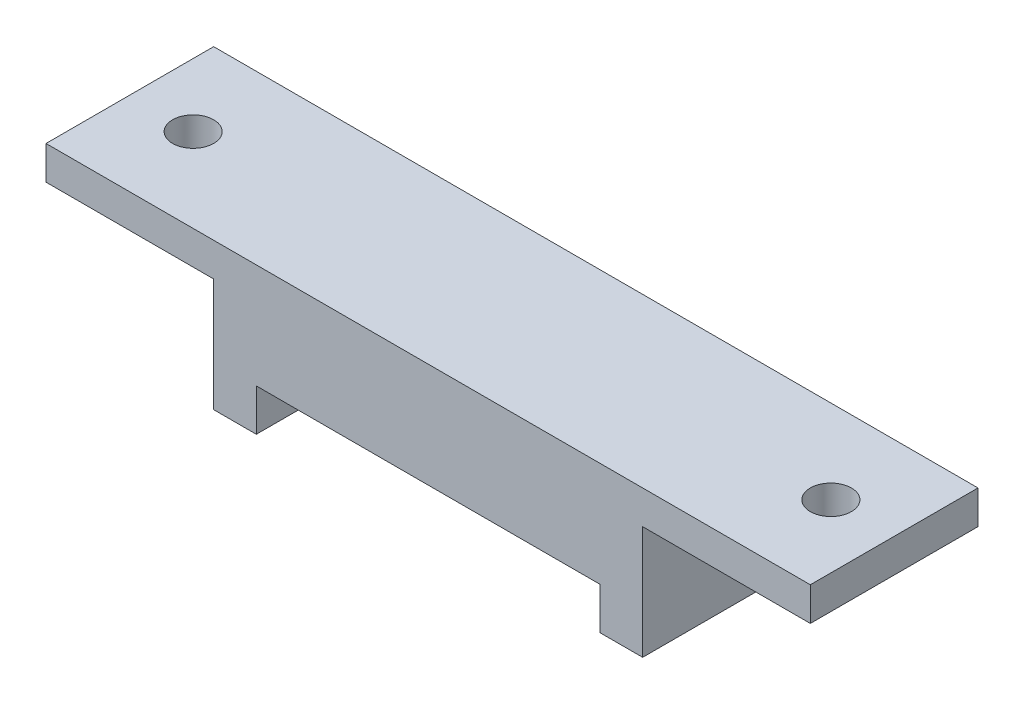
ISO-10303-21;
HEADER;
FILE_DESCRIPTION(('STEP AP214'),'2;1');
FILE_NAME('part.step','',(''),(''),'','','');
FILE_SCHEMA(('AUTOMOTIVE_DESIGN { 1 0 10303 214 1 1 1 1 }'));
ENDSEC;
DATA;
#1=APPLICATION_CONTEXT('core data for automotive mechanical design processes');
#2=APPLICATION_PROTOCOL_DEFINITION('international standard','automotive_design',2000,#1);
#3=PRODUCT_CONTEXT('',#1,'mechanical');
#4=PRODUCT('Part','Part','',(#3));
#5=PRODUCT_RELATED_PRODUCT_CATEGORY('part','',(#4));
#6=PRODUCT_DEFINITION_FORMATION('','',#4);
#7=PRODUCT_DEFINITION_CONTEXT('part definition',#1,'design');
#8=PRODUCT_DEFINITION('design','',#6,#7);
#9=PRODUCT_DEFINITION_SHAPE('','',#8);
#10=(LENGTH_UNIT() NAMED_UNIT(*) SI_UNIT(.MILLI.,.METRE.));
#11=(NAMED_UNIT(*) PLANE_ANGLE_UNIT() SI_UNIT($,.RADIAN.));
#12=(NAMED_UNIT(*) SI_UNIT($,.STERADIAN.) SOLID_ANGLE_UNIT());
#13=UNCERTAINTY_MEASURE_WITH_UNIT(LENGTH_MEASURE(1.E-05),#10,'distance_accuracy_value','');
#14=(GEOMETRIC_REPRESENTATION_CONTEXT(3) GLOBAL_UNCERTAINTY_ASSIGNED_CONTEXT((#13)) GLOBAL_UNIT_ASSIGNED_CONTEXT((#10,
#11,#12)) REPRESENTATION_CONTEXT('',''));
#15=CARTESIAN_POINT('',(0.,0.,0.));
#16=DIRECTION('',(0.,0.,1.));
#17=DIRECTION('',(1.,0.,0.));
#18=AXIS2_PLACEMENT_3D('',#15,#16,#17);
#19=CARTESIAN_POINT('',(-51.6789863974727,0.,0.));
#20=DIRECTION('',(-1.,0.,0.));
#21=DIRECTION('',(0.,0.,1.));
#22=AXIS2_PLACEMENT_3D('',#19,#20,#21);
#23=PLANE('',#22);
#24=DIRECTION('',(0.,-1.,0.));
#25=VECTOR('',#24,1.);
#26=CARTESIAN_POINT('',(-51.6789863974727,56.6616704348161,39.390804236306));
#27=LINE('',#26,#25);
#28=CARTESIAN_POINT('',(-51.6789863974727,56.6616704348161,39.390804236306));
#29=VERTEX_POINT('',#28);
#30=CARTESIAN_POINT('',(-51.6789863974727,52.6616704348161,39.390804236306));
#31=VERTEX_POINT('',#30);
#32=EDGE_CURVE('E154',#29,#31,#27,.T.);
#33=ORIENTED_EDGE('',*,*,#32,.T.);
#34=DIRECTION('',(0.,0.,-1.));
#35=VECTOR('',#34,1.);
#36=CARTESIAN_POINT('',(-51.6789863974727,52.6616704348161,59.3908042363059));
#37=LINE('',#36,#35);
#38=CARTESIAN_POINT('',(-51.6789863974727,52.6616704348161,59.3908042363059));
#39=VERTEX_POINT('',#38);
#40=EDGE_CURVE('E139',#39,#31,#37,.T.);
#41=ORIENTED_EDGE('',*,*,#40,.F.);
#42=DIRECTION('',(0.,1.,0.));
#43=VECTOR('',#42,1.);
#44=CARTESIAN_POINT('',(-51.6789863974727,56.6616704348161,59.3908042363059));
#45=LINE('',#44,#43);
#46=CARTESIAN_POINT('',(-51.6789863974727,56.6616704348161,59.3908042363059));
#47=VERTEX_POINT('',#46);
#48=EDGE_CURVE('E166',#39,#47,#45,.T.);
#49=ORIENTED_EDGE('',*,*,#48,.T.);
#50=DIRECTION('',(0.,0.,-1.));
#51=VECTOR('',#50,1.);
#52=CARTESIAN_POINT('',(-51.6789863974727,56.6616704348161,39.390804236306));
#53=LINE('',#52,#51);
#54=EDGE_CURVE('E164',#47,#29,#53,.T.);
#55=ORIENTED_EDGE('',*,*,#54,.T.);
#56=EDGE_LOOP('',(#33,#41,#49,#55));
#57=FACE_BOUND('',#56,.T.);
#58=ADVANCED_FACE('F47',(#57),#23,.T.);
#59=CARTESIAN_POINT('',(-44.1289863974727,61.6616704348161,49.3908042363059));
#60=DIRECTION('',(0.,-1.,0.));
#61=DIRECTION('',(0.,0.,-1.));
#62=AXIS2_PLACEMENT_3D('',#59,#60,#61);
#63=CYLINDRICAL_SURFACE('',#62,2.45);
#64=CARTESIAN_POINT('',(-44.1289863974727,56.6616704348161,49.3908042363059));
#65=DIRECTION('',(0.,1.,0.));
#66=DIRECTION('',(0.,0.,1.));
#67=AXIS2_PLACEMENT_3D('',#64,#65,#66);
#68=CIRCLE('',#67,2.45);
#69=CARTESIAN_POINT('',(-44.1289863974727,56.6616704348161,51.8408042363059));
#70=VERTEX_POINT('',#69);
#71=EDGE_CURVE('E167',#70,#70,#68,.T.);
#72=ORIENTED_EDGE('',*,*,#71,.T.);
#73=EDGE_LOOP('',(#72));
#74=FACE_BOUND('',#73,.T.);
#75=CARTESIAN_POINT('',(-44.1289863974727,52.6616704348161,49.3908042363059));
#76=DIRECTION('',(0.,-1.,0.));
#77=DIRECTION('',(0.,0.,-1.));
#78=AXIS2_PLACEMENT_3D('',#75,#76,#77);
#79=CIRCLE('',#78,2.45);
#80=CARTESIAN_POINT('',(-44.1289863974727,52.6616704348161,46.9408042363059));
#81=VERTEX_POINT('',#80);
#82=EDGE_CURVE('E215',#81,#81,#79,.F.);
#83=ORIENTED_EDGE('',*,*,#82,.F.);
#84=EDGE_LOOP('',(#83));
#85=FACE_BOUND('',#84,.T.);
#86=ADVANCED_FACE('F332',(#74,#85),#63,.F.);
#87=CARTESIAN_POINT('',(0.,0.,59.3908042363059));
#88=DIRECTION('',(0.,0.,-1.));
#89=DIRECTION('',(-1.,0.,0.));
#90=AXIS2_PLACEMENT_3D('',#87,#88,#89);
#91=PLANE('',#90);
#92=DIRECTION('',(-1.,0.,0.));
#93=VECTOR('',#92,1.);
#94=CARTESIAN_POINT('',(-51.6789863974727,52.6616704348161,59.3908042363059));
#95=LINE('',#94,#93);
#96=CARTESIAN_POINT('',(-31.680486397376,52.6616704348161,59.3908042363059));
#97=VERTEX_POINT('',#96);
#98=EDGE_CURVE('E73',#97,#39,#95,.T.);
#99=ORIENTED_EDGE('',*,*,#98,.F.);
#100=DIRECTION('',(0.,-1.,0.));
#101=VECTOR('',#100,1.);
#102=CARTESIAN_POINT('',(-31.680486397376,51.6616704348161,59.3908042363059));
#103=LINE('',#102,#101);
#104=CARTESIAN_POINT('',(-31.680486397376,39.1616704348161,59.3908042363059));
#105=VERTEX_POINT('',#104);
#106=EDGE_CURVE('E179',#97,#105,#103,.T.);
#107=ORIENTED_EDGE('',*,*,#106,.T.);
#108=DIRECTION('',(-1.,0.,0.));
#109=VECTOR('',#108,1.);
#110=CARTESIAN_POINT('',(-31.680486397376,39.1616704348161,59.3908042363059));
#111=LINE('',#110,#109);
#112=CARTESIAN_POINT('',(-26.591486397376,39.1616704348161,59.3908042363059));
#113=VERTEX_POINT('',#112);
#114=EDGE_CURVE('E173',#113,#105,#111,.T.);
#115=ORIENTED_EDGE('',*,*,#114,.F.);
#116=DIRECTION('',(0.,1.,0.));
#117=VECTOR('',#116,1.);
#118=CARTESIAN_POINT('',(-26.591486397376,44.1616704348162,59.3908042363059));
#119=LINE('',#118,#117);
#120=CARTESIAN_POINT('',(-26.591486397376,44.1616704348162,59.3908042363059));
#121=VERTEX_POINT('',#120);
#122=EDGE_CURVE('E222',#113,#121,#119,.T.);
#123=ORIENTED_EDGE('',*,*,#122,.T.);
#124=DIRECTION('',(-1.,0.,0.));
#125=VECTOR('',#124,1.);
#126=CARTESIAN_POINT('',(10.3465643693983,44.1616704348162,59.3908042363059));
#127=LINE('',#126,#125);
#128=CARTESIAN_POINT('',(14.403513602624,44.1616704348162,59.3908042363059));
#129=VERTEX_POINT('',#128);
#130=EDGE_CURVE('E12',#129,#121,#127,.T.);
#131=ORIENTED_EDGE('',*,*,#130,.F.);
#132=DIRECTION('',(0.,1.,0.));
#133=VECTOR('',#132,1.);
#134=CARTESIAN_POINT('',(14.403513602624,44.1616704348162,59.3908042363059));
#135=LINE('',#134,#133);
#136=CARTESIAN_POINT('',(14.403513602624,39.1616704348161,59.3908042363059));
#137=VERTEX_POINT('',#136);
#138=EDGE_CURVE('E248',#137,#129,#135,.T.);
#139=ORIENTED_EDGE('',*,*,#138,.F.);
#140=DIRECTION('',(-1.,0.,0.));
#141=VECTOR('',#140,1.);
#142=CARTESIAN_POINT('',(19.489513602624,39.1616704348161,59.390804236306));
#143=LINE('',#142,#141);
#144=CARTESIAN_POINT('',(19.489513602624,39.1616704348161,59.390804236306));
#145=VERTEX_POINT('',#144);
#146=EDGE_CURVE('E278',#145,#137,#143,.T.);
#147=ORIENTED_EDGE('',*,*,#146,.F.);
#148=DIRECTION('',(0.,-1.,0.));
#149=VECTOR('',#148,1.);
#150=CARTESIAN_POINT('',(19.489513602624,51.6616704348161,59.3908042363059));
#151=LINE('',#150,#149);
#152=CARTESIAN_POINT('',(19.489513602624,52.6616704348161,59.3908042363059));
#153=VERTEX_POINT('',#152);
#154=EDGE_CURVE('E200',#153,#145,#151,.T.);
#155=ORIENTED_EDGE('',*,*,#154,.F.);
#156=DIRECTION('',(-1.,0.,0.));
#157=VECTOR('',#156,1.);
#158=CARTESIAN_POINT('',(19.489513602624,52.6616704348161,59.3908042363059));
#159=LINE('',#158,#157);
#160=CARTESIAN_POINT('',(39.489513602624,52.6616704348161,59.3908042363059));
#161=VERTEX_POINT('',#160);
#162=EDGE_CURVE('E227',#161,#153,#159,.T.);
#163=ORIENTED_EDGE('',*,*,#162,.F.);
#164=DIRECTION('',(0.,-1.,0.));
#165=VECTOR('',#164,1.);
#166=CARTESIAN_POINT('',(39.489513602624,56.6616704348161,59.3908042363059));
#167=LINE('',#166,#165);
#168=CARTESIAN_POINT('',(39.489513602624,56.6616704348161,59.3908042363059));
#169=VERTEX_POINT('',#168);
#170=EDGE_CURVE('E189',#169,#161,#167,.T.);
#171=ORIENTED_EDGE('',*,*,#170,.F.);
#172=DIRECTION('',(1.,0.,0.));
#173=VECTOR('',#172,1.);
#174=CARTESIAN_POINT('',(-41.6789863974727,56.6616704348161,59.3908042363059));
#175=LINE('',#174,#173);
#176=EDGE_CURVE('E207',#47,#169,#175,.T.);
#177=ORIENTED_EDGE('',*,*,#176,.F.);
#178=ORIENTED_EDGE('',*,*,#48,.F.);
#179=EDGE_LOOP('',(#99,#107,#115,#123,#131,#139,#147,#155,#163,#171,#177,#178));
#180=FACE_BOUND('',#179,.T.);
#181=ADVANCED_FACE('F49',(#180),#91,.F.);
#182=CARTESIAN_POINT('',(0.,0.,39.390804236306));
#183=DIRECTION('',(0.,0.,-1.));
#184=DIRECTION('',(-1.,0.,0.));
#185=AXIS2_PLACEMENT_3D('',#182,#183,#184);
#186=PLANE('',#185);
#187=DIRECTION('',(0.,1.,0.));
#188=VECTOR('',#187,1.);
#189=CARTESIAN_POINT('',(-31.680486397376,51.6616704348161,39.3908042363059));
#190=LINE('',#189,#188);
#191=CARTESIAN_POINT('',(-31.680486397376,39.1616704348161,39.390804236306));
#192=VERTEX_POINT('',#191);
#193=CARTESIAN_POINT('',(-31.680486397376,52.6616704348161,39.390804236306));
#194=VERTEX_POINT('',#193);
#195=EDGE_CURVE('E157',#192,#194,#190,.T.);
#196=ORIENTED_EDGE('',*,*,#195,.T.);
#197=DIRECTION('',(1.,0.,0.));
#198=VECTOR('',#197,1.);
#199=CARTESIAN_POINT('',(-51.6789863974727,52.6616704348161,39.390804236306));
#200=LINE('',#199,#198);
#201=EDGE_CURVE('E143',#31,#194,#200,.T.);
#202=ORIENTED_EDGE('',*,*,#201,.F.);
#203=ORIENTED_EDGE('',*,*,#32,.F.);
#204=DIRECTION('',(-1.,0.,0.));
#205=VECTOR('',#204,1.);
#206=CARTESIAN_POINT('',(29.489513602624,56.6616704348161,39.3908042363059));
#207=LINE('',#206,#205);
#208=CARTESIAN_POINT('',(39.489513602624,56.6616704348161,39.3908042363059));
#209=VERTEX_POINT('',#208);
#210=EDGE_CURVE('E210',#209,#29,#207,.T.);
#211=ORIENTED_EDGE('',*,*,#210,.F.);
#212=DIRECTION('',(0.,1.,0.));
#213=VECTOR('',#212,1.);
#214=CARTESIAN_POINT('',(39.489513602624,56.6616704348161,39.3908042363059));
#215=LINE('',#214,#213);
#216=CARTESIAN_POINT('',(39.489513602624,52.6616704348161,39.3908042363059));
#217=VERTEX_POINT('',#216);
#218=EDGE_CURVE('E193',#217,#209,#215,.T.);
#219=ORIENTED_EDGE('',*,*,#218,.F.);
#220=DIRECTION('',(1.,0.,0.));
#221=VECTOR('',#220,1.);
#222=CARTESIAN_POINT('',(19.489513602624,52.6616704348161,39.3908042363059));
#223=LINE('',#222,#221);
#224=CARTESIAN_POINT('',(19.489513602624,52.6616704348161,39.3908042363059));
#225=VERTEX_POINT('',#224);
#226=EDGE_CURVE('E65',#225,#217,#223,.T.);
#227=ORIENTED_EDGE('',*,*,#226,.F.);
#228=DIRECTION('',(0.,1.,0.));
#229=VECTOR('',#228,1.);
#230=CARTESIAN_POINT('',(19.489513602624,51.6616704348161,39.3908042363059));
#231=LINE('',#230,#229);
#232=CARTESIAN_POINT('',(19.489513602624,39.1616704348161,39.3908042363059));
#233=VERTEX_POINT('',#232);
#234=EDGE_CURVE('E204',#233,#225,#231,.T.);
#235=ORIENTED_EDGE('',*,*,#234,.F.);
#236=DIRECTION('',(1.,0.,0.));
#237=VECTOR('',#236,1.);
#238=CARTESIAN_POINT('',(19.489513602624,39.1616704348161,39.3908042363059));
#239=LINE('',#238,#237);
#240=CARTESIAN_POINT('',(14.403513602624,39.1616704348161,39.3908042363059));
#241=VERTEX_POINT('',#240);
#242=EDGE_CURVE('E264',#241,#233,#239,.T.);
#243=ORIENTED_EDGE('',*,*,#242,.F.);
#244=DIRECTION('',(0.,1.,0.));
#245=VECTOR('',#244,1.);
#246=CARTESIAN_POINT('',(14.403513602624,44.1616704348162,39.3908042363059));
#247=LINE('',#246,#245);
#248=CARTESIAN_POINT('',(14.403513602624,44.1616704348162,39.3908042363059));
#249=VERTEX_POINT('',#248);
#250=EDGE_CURVE('E252',#241,#249,#247,.T.);
#251=ORIENTED_EDGE('',*,*,#250,.T.);
#252=DIRECTION('',(-1.,0.,0.));
#253=VECTOR('',#252,1.);
#254=CARTESIAN_POINT('',(10.3465643693983,44.1616704348162,39.390804236306));
#255=LINE('',#254,#253);
#256=CARTESIAN_POINT('',(-26.591486397376,44.1616704348162,39.3908042363059));
#257=VERTEX_POINT('',#256);
#258=EDGE_CURVE('E57',#249,#257,#255,.T.);
#259=ORIENTED_EDGE('',*,*,#258,.T.);
#260=DIRECTION('',(0.,1.,0.));
#261=VECTOR('',#260,1.);
#262=CARTESIAN_POINT('',(-26.591486397376,44.1616704348162,39.3908042363059));
#263=LINE('',#262,#261);
#264=CARTESIAN_POINT('',(-26.591486397376,39.1616704348161,39.3908042363059));
#265=VERTEX_POINT('',#264);
#266=EDGE_CURVE('E238',#265,#257,#263,.T.);
#267=ORIENTED_EDGE('',*,*,#266,.F.);
#268=DIRECTION('',(1.,0.,0.));
#269=VECTOR('',#268,1.);
#270=CARTESIAN_POINT('',(-31.680486397376,39.1616704348161,39.390804236306));
#271=LINE('',#270,#269);
#272=EDGE_CURVE('E270',#192,#265,#271,.T.);
#273=ORIENTED_EDGE('',*,*,#272,.F.);
#274=EDGE_LOOP('',(#196,#202,#203,#211,#219,#227,#235,#243,#251,#259,#267,#273));
#275=FACE_BOUND('',#274,.T.);
#276=ADVANCED_FACE('F152',(#275),#186,.T.);
#277=CARTESIAN_POINT('',(-31.680486397376,0.,0.));
#278=DIRECTION('',(-1.,0.,0.));
#279=DIRECTION('',(0.,0.,-1.));
#280=AXIS2_PLACEMENT_3D('',#277,#278,#279);
#281=PLANE('',#280);
#282=ORIENTED_EDGE('',*,*,#195,.F.);
#283=DIRECTION('',(0.,0.,-1.));
#284=VECTOR('',#283,1.);
#285=CARTESIAN_POINT('',(-31.680486397376,39.1616704348161,59.3908042363059));
#286=LINE('',#285,#284);
#287=EDGE_CURVE('E267',#105,#192,#286,.T.);
#288=ORIENTED_EDGE('',*,*,#287,.F.);
#289=ORIENTED_EDGE('',*,*,#106,.F.);
#290=DIRECTION('',(0.,0.,1.));
#291=VECTOR('',#290,1.);
#292=CARTESIAN_POINT('',(-31.680486397376,52.6616704348161,59.3908042363059));
#293=LINE('',#292,#291);
#294=EDGE_CURVE('E160',#194,#97,#293,.T.);
#295=ORIENTED_EDGE('',*,*,#294,.F.);
#296=EDGE_LOOP('',(#282,#288,#289,#295));
#297=FACE_BOUND('',#296,.T.);
#298=ADVANCED_FACE('F307',(#297),#281,.T.);
#299=CARTESIAN_POINT('',(10.3465643693983,44.1616704348162,-143.861175798543));
#300=DIRECTION('',(0.,1.,0.));
#301=DIRECTION('',(-1.,0.,0.));
#302=AXIS2_PLACEMENT_3D('',#299,#300,#301);
#303=PLANE('',#302);
#304=ORIENTED_EDGE('',*,*,#130,.T.);
#305=DIRECTION('',(0.,0.,1.));
#306=VECTOR('',#305,1.);
#307=CARTESIAN_POINT('',(-26.591486397376,44.1616704348162,39.3908042363059));
#308=LINE('',#307,#306);
#309=EDGE_CURVE('E245',#257,#121,#308,.T.);
#310=ORIENTED_EDGE('',*,*,#309,.F.);
#311=ORIENTED_EDGE('',*,*,#258,.F.);
#312=DIRECTION('',(0.,0.,1.));
#313=VECTOR('',#312,1.);
#314=CARTESIAN_POINT('',(14.403513602624,44.1616704348162,39.3908042363059));
#315=LINE('',#314,#313);
#316=EDGE_CURVE('E260',#249,#129,#315,.T.);
#317=ORIENTED_EDGE('',*,*,#316,.T.);
#318=EDGE_LOOP('',(#304,#310,#311,#317));
#319=FACE_BOUND('',#318,.T.);
#320=ADVANCED_FACE('F317',(#319),#303,.F.);
#321=CARTESIAN_POINT('',(0.,56.6616704348161,0.));
#322=DIRECTION('',(0.,1.,0.));
#323=DIRECTION('',(0.,0.,1.));
#324=AXIS2_PLACEMENT_3D('',#321,#322,#323);
#325=PLANE('',#324);
#326=ORIENTED_EDGE('',*,*,#71,.F.);
#327=EDGE_LOOP('',(#326));
#328=FACE_BOUND('',#327,.T.);
#329=CARTESIAN_POINT('',(31.939513602624,56.6616704348161,49.3908042363059));
#330=DIRECTION('',(0.,1.,0.));
#331=DIRECTION('',(0.,0.,1.));
#332=AXIS2_PLACEMENT_3D('',#329,#330,#331);
#333=CIRCLE('',#332,2.45);
#334=CARTESIAN_POINT('',(31.939513602624,56.6616704348161,51.8408042363059));
#335=VERTEX_POINT('',#334);
#336=EDGE_CURVE('E185',#335,#335,#333,.T.);
#337=ORIENTED_EDGE('',*,*,#336,.F.);
#338=EDGE_LOOP('',(#337));
#339=FACE_BOUND('',#338,.T.);
#340=ORIENTED_EDGE('',*,*,#210,.T.);
#341=ORIENTED_EDGE('',*,*,#54,.F.);
#342=ORIENTED_EDGE('',*,*,#176,.T.);
#343=DIRECTION('',(0.,0.,1.));
#344=VECTOR('',#343,1.);
#345=CARTESIAN_POINT('',(39.489513602624,56.6616704348161,59.3908042363059));
#346=LINE('',#345,#344);
#347=EDGE_CURVE('E196',#209,#169,#346,.T.);
#348=ORIENTED_EDGE('',*,*,#347,.F.);
#349=EDGE_LOOP('',(#340,#341,#342,#348));
#350=FACE_BOUND('',#349,.T.);
#351=ADVANCED_FACE('F304',(#328,#339,#350),#325,.T.);
#352=CARTESIAN_POINT('',(19.489513602624,0.,0.));
#353=DIRECTION('',(1.,0.,0.));
#354=DIRECTION('',(0.,0.,-1.));
#355=AXIS2_PLACEMENT_3D('',#352,#353,#354);
#356=PLANE('',#355);
#357=DIRECTION('',(0.,0.,1.));
#358=VECTOR('',#357,1.);
#359=CARTESIAN_POINT('',(19.489513602624,39.1616704348161,59.390804236306));
#360=LINE('',#359,#358);
#361=EDGE_CURVE('E271',#233,#145,#360,.T.);
#362=ORIENTED_EDGE('',*,*,#361,.F.);
#363=ORIENTED_EDGE('',*,*,#234,.T.);
#364=DIRECTION('',(0.,0.,-1.));
#365=VECTOR('',#364,1.);
#366=CARTESIAN_POINT('',(19.489513602624,52.6616704348161,39.3908042363059));
#367=LINE('',#366,#365);
#368=EDGE_CURVE('E148',#153,#225,#367,.T.);
#369=ORIENTED_EDGE('',*,*,#368,.F.);
#370=ORIENTED_EDGE('',*,*,#154,.T.);
#371=EDGE_LOOP('',(#362,#363,#369,#370));
#372=FACE_BOUND('',#371,.T.);
#373=ADVANCED_FACE('F294',(#372),#356,.T.);
#374=CARTESIAN_POINT('',(39.489513602624,0.,0.));
#375=DIRECTION('',(1.,0.,0.));
#376=DIRECTION('',(0.,0.,-1.));
#377=AXIS2_PLACEMENT_3D('',#374,#375,#376);
#378=PLANE('',#377);
#379=DIRECTION('',(0.,0.,1.));
#380=VECTOR('',#379,1.);
#381=CARTESIAN_POINT('',(39.489513602624,52.6616704348161,39.3908042363059));
#382=LINE('',#381,#380);
#383=EDGE_CURVE('E231',#217,#161,#382,.T.);
#384=ORIENTED_EDGE('',*,*,#383,.F.);
#385=ORIENTED_EDGE('',*,*,#218,.T.);
#386=ORIENTED_EDGE('',*,*,#347,.T.);
#387=ORIENTED_EDGE('',*,*,#170,.T.);
#388=EDGE_LOOP('',(#384,#385,#386,#387));
#389=FACE_BOUND('',#388,.T.);
#390=ADVANCED_FACE('F300',(#389),#378,.T.);
#391=CARTESIAN_POINT('',(31.939513602624,61.6616704348161,49.3908042363059));
#392=DIRECTION('',(0.,-1.,0.));
#393=DIRECTION('',(0.,0.,-1.));
#394=AXIS2_PLACEMENT_3D('',#391,#392,#393);
#395=CYLINDRICAL_SURFACE('',#394,2.45);
#396=CARTESIAN_POINT('',(31.939513602624,52.6616704348161,49.3908042363059));
#397=DIRECTION('',(0.,1.,0.));
#398=DIRECTION('',(0.,0.,1.));
#399=AXIS2_PLACEMENT_3D('',#396,#397,#398);
#400=CIRCLE('',#399,2.45);
#401=CARTESIAN_POINT('',(31.939513602624,52.6616704348161,51.8408042363059));
#402=VERTEX_POINT('',#401);
#403=EDGE_CURVE('E51',#402,#402,#400,.F.);
#404=ORIENTED_EDGE('',*,*,#403,.T.);
#405=EDGE_LOOP('',(#404));
#406=FACE_BOUND('',#405,.T.);
#407=ORIENTED_EDGE('',*,*,#336,.T.);
#408=EDGE_LOOP('',(#407));
#409=FACE_BOUND('',#408,.T.);
#410=ADVANCED_FACE('F343',(#406,#409),#395,.F.);
#411=CARTESIAN_POINT('',(0.,39.1616704348161,0.));
#412=DIRECTION('',(0.,-1.,0.));
#413=DIRECTION('',(0.,0.,-1.));
#414=AXIS2_PLACEMENT_3D('',#411,#412,#413);
#415=PLANE('',#414);
#416=ORIENTED_EDGE('',*,*,#272,.T.);
#417=DIRECTION('',(0.,0.,1.));
#418=VECTOR('',#417,1.);
#419=CARTESIAN_POINT('',(-26.591486397376,39.1616704348161,39.3908042363059));
#420=LINE('',#419,#418);
#421=EDGE_CURVE('E241',#265,#113,#420,.T.);
#422=ORIENTED_EDGE('',*,*,#421,.T.);
#423=ORIENTED_EDGE('',*,*,#114,.T.);
#424=ORIENTED_EDGE('',*,*,#287,.T.);
#425=EDGE_LOOP('',(#416,#422,#423,#424));
#426=FACE_BOUND('',#425,.T.);
#427=ADVANCED_FACE('F309',(#426),#415,.T.);
#428=CARTESIAN_POINT('',(0.,39.1616704348161,0.));
#429=DIRECTION('',(0.,1.,0.));
#430=DIRECTION('',(0.,0.,1.));
#431=AXIS2_PLACEMENT_3D('',#428,#429,#430);
#432=PLANE('',#431);
#433=ORIENTED_EDGE('',*,*,#146,.T.);
#434=DIRECTION('',(0.,0.,1.));
#435=VECTOR('',#434,1.);
#436=CARTESIAN_POINT('',(14.403513602624,39.1616704348161,39.3908042363059));
#437=LINE('',#436,#435);
#438=EDGE_CURVE('E256',#241,#137,#437,.T.);
#439=ORIENTED_EDGE('',*,*,#438,.F.);
#440=ORIENTED_EDGE('',*,*,#242,.T.);
#441=ORIENTED_EDGE('',*,*,#361,.T.);
#442=EDGE_LOOP('',(#433,#439,#440,#441));
#443=FACE_BOUND('',#442,.T.);
#444=ADVANCED_FACE('F285',(#443),#432,.F.);
#445=CARTESIAN_POINT('',(14.403513602624,44.1616704348162,39.3908042363059));
#446=DIRECTION('',(1.,0.,0.));
#447=DIRECTION('',(0.,1.,0.));
#448=AXIS2_PLACEMENT_3D('',#445,#446,#447);
#449=PLANE('',#448);
#450=ORIENTED_EDGE('',*,*,#138,.T.);
#451=ORIENTED_EDGE('',*,*,#316,.F.);
#452=ORIENTED_EDGE('',*,*,#250,.F.);
#453=ORIENTED_EDGE('',*,*,#438,.T.);
#454=EDGE_LOOP('',(#450,#451,#452,#453));
#455=FACE_BOUND('',#454,.T.);
#456=ADVANCED_FACE('F320',(#455),#449,.F.);
#457=CARTESIAN_POINT('',(-26.591486397376,44.1616704348162,39.3908042363059));
#458=DIRECTION('',(1.,0.,0.));
#459=DIRECTION('',(0.,1.,0.));
#460=AXIS2_PLACEMENT_3D('',#457,#458,#459);
#461=PLANE('',#460);
#462=ORIENTED_EDGE('',*,*,#122,.F.);
#463=ORIENTED_EDGE('',*,*,#421,.F.);
#464=ORIENTED_EDGE('',*,*,#266,.T.);
#465=ORIENTED_EDGE('',*,*,#309,.T.);
#466=EDGE_LOOP('',(#462,#463,#464,#465));
#467=FACE_BOUND('',#466,.T.);
#468=ADVANCED_FACE('F315',(#467),#461,.T.);
#469=CARTESIAN_POINT('',(0.,52.6616704348161,0.));
#470=DIRECTION('',(0.,-1.,0.));
#471=DIRECTION('',(0.,0.,-1.));
#472=AXIS2_PLACEMENT_3D('',#469,#470,#471);
#473=PLANE('',#472);
#474=ORIENTED_EDGE('',*,*,#40,.T.);
#475=ORIENTED_EDGE('',*,*,#201,.T.);
#476=ORIENTED_EDGE('',*,*,#294,.T.);
#477=ORIENTED_EDGE('',*,*,#98,.T.);
#478=EDGE_LOOP('',(#474,#475,#476,#477));
#479=FACE_BOUND('',#478,.T.);
#480=ORIENTED_EDGE('',*,*,#82,.T.);
#481=EDGE_LOOP('',(#480));
#482=FACE_BOUND('',#481,.T.);
#483=ADVANCED_FACE('F141',(#479,#482),#473,.T.);
#484=CARTESIAN_POINT('',(0.,52.6616704348161,0.));
#485=DIRECTION('',(0.,1.,0.));
#486=DIRECTION('',(0.,0.,1.));
#487=AXIS2_PLACEMENT_3D('',#484,#485,#486);
#488=PLANE('',#487);
#489=ORIENTED_EDGE('',*,*,#368,.T.);
#490=ORIENTED_EDGE('',*,*,#226,.T.);
#491=ORIENTED_EDGE('',*,*,#383,.T.);
#492=ORIENTED_EDGE('',*,*,#162,.T.);
#493=EDGE_LOOP('',(#489,#490,#491,#492));
#494=FACE_BOUND('',#493,.T.);
#495=ORIENTED_EDGE('',*,*,#403,.F.);
#496=EDGE_LOOP('',(#495));
#497=FACE_BOUND('',#496,.T.);
#498=ADVANCED_FACE('F295',(#494,#497),#488,.F.);
#499=CLOSED_SHELL('',(#58,#86,#181,#276,#298,#320,#351,#373,#390,#410,#427,#444,#456,#468,#483,#498));
#500=MANIFOLD_SOLID_BREP('B2',#499);
#501=ADVANCED_BREP_SHAPE_REPRESENTATION('',(#18,#500),#14);
#502=SHAPE_DEFINITION_REPRESENTATION(#9,#501);
ENDSEC;
END-ISO-10303-21;
